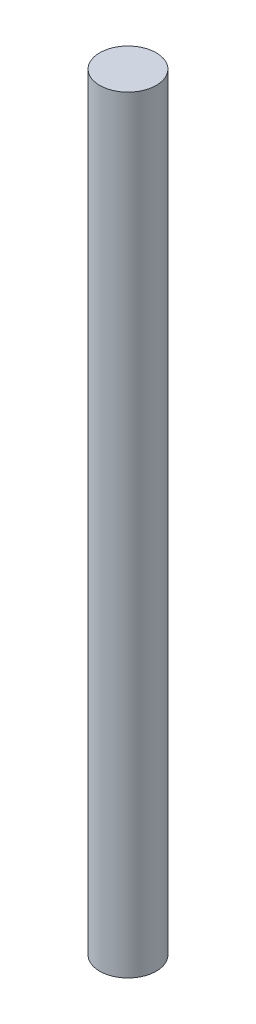
ISO-10303-21;
HEADER;
FILE_DESCRIPTION(('STEP AP214'),'2;1');
FILE_NAME('part.step','',(''),(''),'','','');
FILE_SCHEMA(('AUTOMOTIVE_DESIGN { 1 0 10303 214 1 1 1 1 }'));
ENDSEC;
DATA;
#1=APPLICATION_CONTEXT('core data for automotive mechanical design processes');
#2=APPLICATION_PROTOCOL_DEFINITION('international standard','automotive_design',2000,#1);
#3=PRODUCT_CONTEXT('',#1,'mechanical');
#4=PRODUCT('Part','Part','',(#3));
#5=PRODUCT_RELATED_PRODUCT_CATEGORY('part','',(#4));
#6=PRODUCT_DEFINITION_FORMATION('','',#4);
#7=PRODUCT_DEFINITION_CONTEXT('part definition',#1,'design');
#8=PRODUCT_DEFINITION('design','',#6,#7);
#9=PRODUCT_DEFINITION_SHAPE('','',#8);
#10=(LENGTH_UNIT() NAMED_UNIT(*) SI_UNIT(.MILLI.,.METRE.));
#11=(NAMED_UNIT(*) PLANE_ANGLE_UNIT() SI_UNIT($,.RADIAN.));
#12=(NAMED_UNIT(*) SI_UNIT($,.STERADIAN.) SOLID_ANGLE_UNIT());
#13=UNCERTAINTY_MEASURE_WITH_UNIT(LENGTH_MEASURE(1.E-05),#10,'distance_accuracy_value','');
#14=(GEOMETRIC_REPRESENTATION_CONTEXT(3) GLOBAL_UNCERTAINTY_ASSIGNED_CONTEXT((#13)) GLOBAL_UNIT_ASSIGNED_CONTEXT((#10,
#11,#12)) REPRESENTATION_CONTEXT('',''));
#15=CARTESIAN_POINT('',(0.,0.,0.));
#16=DIRECTION('',(0.,0.,1.));
#17=DIRECTION('',(1.,0.,0.));
#18=AXIS2_PLACEMENT_3D('',#15,#16,#17);
#19=CARTESIAN_POINT('',(0.,38.,0.));
#20=DIRECTION('',(0.,-1.,0.));
#21=DIRECTION('',(0.,0.,-1.));
#22=AXIS2_PLACEMENT_3D('',#19,#20,#21);
#23=CYLINDRICAL_SURFACE('',#22,1.4);
#24=CARTESIAN_POINT('',(0.,38.,0.));
#25=DIRECTION('',(0.,1.,0.));
#26=DIRECTION('',(0.,0.,1.));
#27=AXIS2_PLACEMENT_3D('',#24,#25,#26);
#28=CIRCLE('',#27,1.4);
#29=CARTESIAN_POINT('',(0.,38.,1.4));
#30=VERTEX_POINT('',#29);
#31=EDGE_CURVE('E10',#30,#30,#28,.T.);
#32=ORIENTED_EDGE('',*,*,#31,.F.);
#33=EDGE_LOOP('',(#32));
#34=FACE_BOUND('',#33,.T.);
#35=CARTESIAN_POINT('',(0.,0.,0.));
#36=DIRECTION('',(0.,1.,0.));
#37=DIRECTION('',(0.,0.,1.));
#38=AXIS2_PLACEMENT_3D('',#35,#36,#37);
#39=CIRCLE('',#38,1.4);
#40=CARTESIAN_POINT('',(0.,0.,1.4));
#41=VERTEX_POINT('',#40);
#42=EDGE_CURVE('E34',#41,#41,#39,.T.);
#43=ORIENTED_EDGE('',*,*,#42,.T.);
#44=EDGE_LOOP('',(#43));
#45=FACE_BOUND('',#44,.T.);
#46=ADVANCED_FACE('F31',(#34,#45),#23,.T.);
#47=CARTESIAN_POINT('',(0.,38.,0.));
#48=DIRECTION('',(0.,1.,0.));
#49=DIRECTION('',(0.,0.,1.));
#50=AXIS2_PLACEMENT_3D('',#47,#48,#49);
#51=PLANE('',#50);
#52=ORIENTED_EDGE('',*,*,#31,.T.);
#53=EDGE_LOOP('',(#52));
#54=FACE_BOUND('',#53,.T.);
#55=ADVANCED_FACE('F46',(#54),#51,.T.);
#56=CARTESIAN_POINT('',(0.,0.,0.));
#57=DIRECTION('',(0.,1.,0.));
#58=DIRECTION('',(0.,0.,1.));
#59=AXIS2_PLACEMENT_3D('',#56,#57,#58);
#60=PLANE('',#59);
#61=ORIENTED_EDGE('',*,*,#42,.F.);
#62=EDGE_LOOP('',(#61));
#63=FACE_BOUND('',#62,.T.);
#64=ADVANCED_FACE('F44',(#63),#60,.F.);
#65=CLOSED_SHELL('',(#46,#55,#64));
#66=MANIFOLD_SOLID_BREP('B2',#65);
#67=ADVANCED_BREP_SHAPE_REPRESENTATION('',(#18,#66),#14);
#68=SHAPE_DEFINITION_REPRESENTATION(#9,#67);
ENDSEC;
END-ISO-10303-21;
